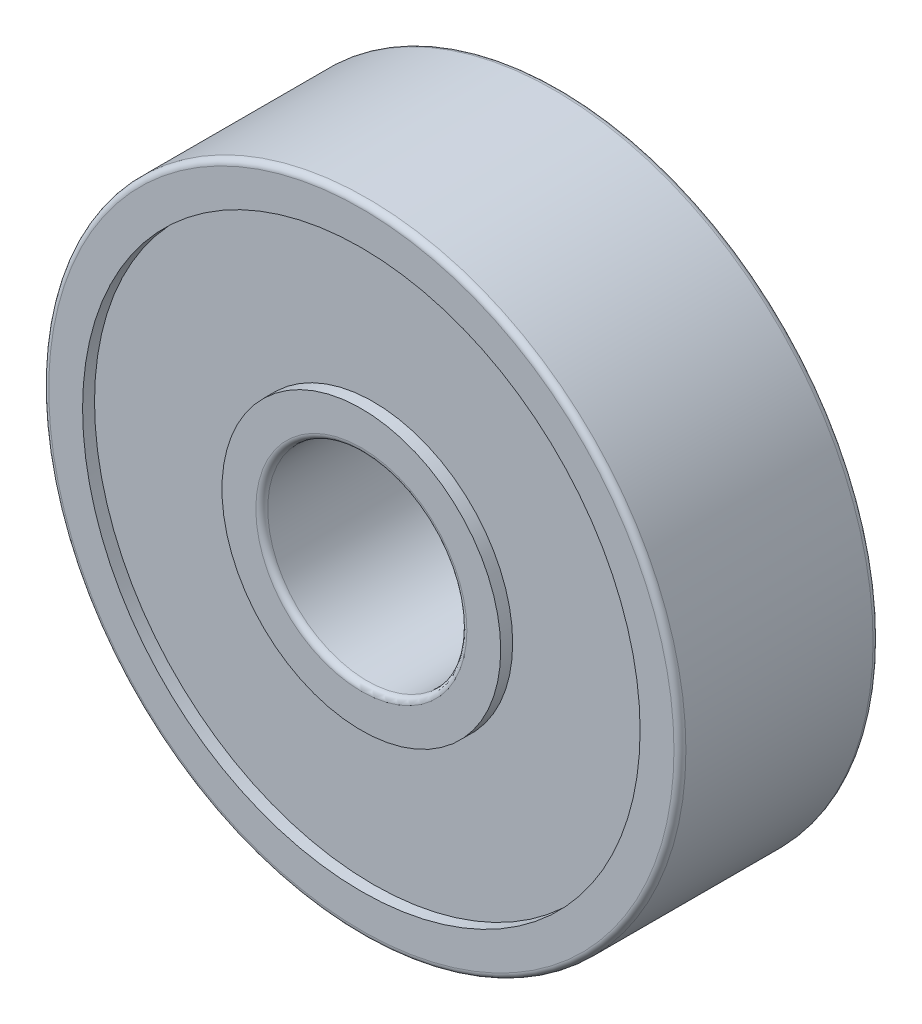
ISO-10303-21;
HEADER;
FILE_DESCRIPTION(('STEP AP214'),'2;1');
FILE_NAME('part.step','',(''),(''),'','','');
FILE_SCHEMA(('AUTOMOTIVE_DESIGN { 1 0 10303 214 1 1 1 1 }'));
ENDSEC;
DATA;
#1=APPLICATION_CONTEXT('core data for automotive mechanical design processes');
#2=APPLICATION_PROTOCOL_DEFINITION('international standard','automotive_design',2000,#1);
#3=PRODUCT_CONTEXT('',#1,'mechanical');
#4=PRODUCT('Part','Part','',(#3));
#5=PRODUCT_RELATED_PRODUCT_CATEGORY('part','',(#4));
#6=PRODUCT_DEFINITION_FORMATION('','',#4);
#7=PRODUCT_DEFINITION_CONTEXT('part definition',#1,'design');
#8=PRODUCT_DEFINITION('design','',#6,#7);
#9=PRODUCT_DEFINITION_SHAPE('','',#8);
#10=(LENGTH_UNIT() NAMED_UNIT(*) SI_UNIT(.MILLI.,.METRE.));
#11=(NAMED_UNIT(*) PLANE_ANGLE_UNIT() SI_UNIT($,.RADIAN.));
#12=(NAMED_UNIT(*) SI_UNIT($,.STERADIAN.) SOLID_ANGLE_UNIT());
#13=UNCERTAINTY_MEASURE_WITH_UNIT(LENGTH_MEASURE(1.E-05),#10,'distance_accuracy_value','');
#14=(GEOMETRIC_REPRESENTATION_CONTEXT(3) GLOBAL_UNCERTAINTY_ASSIGNED_CONTEXT((#13)) GLOBAL_UNIT_ASSIGNED_CONTEXT((#10,
#11,#12)) REPRESENTATION_CONTEXT('',''));
#15=CARTESIAN_POINT('',(0.,0.,0.));
#16=DIRECTION('',(0.,0.,1.));
#17=DIRECTION('',(1.,0.,0.));
#18=AXIS2_PLACEMENT_3D('',#15,#16,#17);
#19=CARTESIAN_POINT('',(0.,0.,0.));
#20=DIRECTION('',(0.,0.,1.));
#21=DIRECTION('',(1.,0.,0.));
#22=AXIS2_PLACEMENT_3D('',#19,#20,#21);
#23=PLANE('',#22);
#24=CARTESIAN_POINT('',(0.,0.,0.));
#25=DIRECTION('',(0.,0.,1.));
#26=DIRECTION('',(1.,0.,0.));
#27=AXIS2_PLACEMENT_3D('',#24,#25,#26);
#28=CIRCLE('',#27,2.65);
#29=CARTESIAN_POINT('',(2.65,0.,0.));
#30=VERTEX_POINT('',#29);
#31=EDGE_CURVE('E62',#30,#30,#28,.T.);
#32=ORIENTED_EDGE('',*,*,#31,.T.);
#33=EDGE_LOOP('',(#32));
#34=FACE_BOUND('',#33,.T.);
#35=CARTESIAN_POINT('',(0.,0.,0.));
#36=DIRECTION('',(0.,0.,1.));
#37=DIRECTION('',(1.,0.,0.));
#38=AXIS2_PLACEMENT_3D('',#35,#36,#37);
#39=CIRCLE('',#38,3.5);
#40=CARTESIAN_POINT('',(3.5,0.,0.));
#41=VERTEX_POINT('',#40);
#42=EDGE_CURVE('E84',#41,#41,#39,.T.);
#43=ORIENTED_EDGE('',*,*,#42,.F.);
#44=EDGE_LOOP('',(#43));
#45=FACE_BOUND('',#44,.T.);
#46=ADVANCED_FACE('F33',(#34,#45),#23,.F.);
#47=CARTESIAN_POINT('',(0.,0.,5.));
#48=DIRECTION('',(0.,0.,1.));
#49=DIRECTION('',(1.,0.,0.));
#50=AXIS2_PLACEMENT_3D('',#47,#48,#49);
#51=PLANE('',#50);
#52=CARTESIAN_POINT('',(0.,0.,5.));
#53=DIRECTION('',(0.,0.,1.));
#54=DIRECTION('',(1.,0.,0.));
#55=AXIS2_PLACEMENT_3D('',#52,#53,#54);
#56=CIRCLE('',#55,2.65);
#57=CARTESIAN_POINT('',(2.65,0.,5.));
#58=VERTEX_POINT('',#57);
#59=EDGE_CURVE('E40',#58,#58,#56,.F.);
#60=ORIENTED_EDGE('',*,*,#59,.T.);
#61=EDGE_LOOP('',(#60));
#62=FACE_BOUND('',#61,.T.);
#63=CARTESIAN_POINT('',(0.,0.,5.));
#64=DIRECTION('',(0.,0.,1.));
#65=DIRECTION('',(1.,0.,0.));
#66=AXIS2_PLACEMENT_3D('',#63,#64,#65);
#67=CIRCLE('',#66,3.5);
#68=CARTESIAN_POINT('',(3.5,0.,5.));
#69=VERTEX_POINT('',#68);
#70=EDGE_CURVE('E72',#69,#69,#67,.T.);
#71=ORIENTED_EDGE('',*,*,#70,.T.);
#72=EDGE_LOOP('',(#71));
#73=FACE_BOUND('',#72,.T.);
#74=ADVANCED_FACE('F101',(#62,#73),#51,.T.);
#75=CARTESIAN_POINT('',(0.,0.,5.));
#76=DIRECTION('',(0.,0.,1.));
#77=DIRECTION('',(1.,0.,0.));
#78=AXIS2_PLACEMENT_3D('',#75,#76,#77);
#79=CIRCLE('',#78,7.85);
#80=CARTESIAN_POINT('',(7.85,0.,5.));
#81=VERTEX_POINT('',#80);
#82=EDGE_CURVE('E10',#81,#81,#79,.T.);
#83=ORIENTED_EDGE('',*,*,#82,.T.);
#84=EDGE_LOOP('',(#83));
#85=FACE_BOUND('',#84,.T.);
#86=CARTESIAN_POINT('',(0.,0.,5.));
#87=DIRECTION('',(0.,0.,1.));
#88=DIRECTION('',(1.,0.,0.));
#89=AXIS2_PLACEMENT_3D('',#86,#87,#88);
#90=CIRCLE('',#89,7.);
#91=CARTESIAN_POINT('',(7.,0.,5.));
#92=VERTEX_POINT('',#91);
#93=EDGE_CURVE('E66',#92,#92,#90,.T.);
#94=ORIENTED_EDGE('',*,*,#93,.F.);
#95=EDGE_LOOP('',(#94));
#96=FACE_BOUND('',#95,.T.);
#97=ADVANCED_FACE('F108',(#85,#96),#51,.T.);
#98=CARTESIAN_POINT('',(0.,0.,0.));
#99=DIRECTION('',(0.,0.,1.));
#100=DIRECTION('',(1.,0.,0.));
#101=AXIS2_PLACEMENT_3D('',#98,#99,#100);
#102=CIRCLE('',#101,7.85);
#103=CARTESIAN_POINT('',(7.85,0.,0.));
#104=VERTEX_POINT('',#103);
#105=EDGE_CURVE('E44',#104,#104,#102,.F.);
#106=ORIENTED_EDGE('',*,*,#105,.T.);
#107=EDGE_LOOP('',(#106));
#108=FACE_BOUND('',#107,.T.);
#109=CARTESIAN_POINT('',(0.,0.,0.));
#110=DIRECTION('',(0.,0.,1.));
#111=DIRECTION('',(1.,0.,0.));
#112=AXIS2_PLACEMENT_3D('',#109,#110,#111);
#113=CIRCLE('',#112,7.);
#114=CARTESIAN_POINT('',(7.,0.,0.));
#115=VERTEX_POINT('',#114);
#116=EDGE_CURVE('E78',#115,#115,#113,.T.);
#117=ORIENTED_EDGE('',*,*,#116,.T.);
#118=EDGE_LOOP('',(#117));
#119=FACE_BOUND('',#118,.T.);
#120=ADVANCED_FACE('F104',(#108,#119),#23,.F.);
#121=CARTESIAN_POINT('',(0.,0.,5.));
#122=DIRECTION('',(0.,0.,-1.));
#123=DIRECTION('',(-1.,0.,0.));
#124=AXIS2_PLACEMENT_3D('',#121,#122,#123);
#125=CYLINDRICAL_SURFACE('',#124,8.);
#126=CARTESIAN_POINT('',(0.,0.,0.15));
#127=DIRECTION('',(0.,0.,1.));
#128=DIRECTION('',(1.,0.,0.));
#129=AXIS2_PLACEMENT_3D('',#126,#127,#128);
#130=CIRCLE('',#129,8.);
#131=CARTESIAN_POINT('',(8.,0.,0.15));
#132=VERTEX_POINT('',#131);
#133=EDGE_CURVE('E48',#132,#132,#130,.T.);
#134=ORIENTED_EDGE('',*,*,#133,.T.);
#135=EDGE_LOOP('',(#134));
#136=FACE_BOUND('',#135,.T.);
#137=CARTESIAN_POINT('',(0.,0.,4.85));
#138=DIRECTION('',(0.,0.,1.));
#139=DIRECTION('',(1.,0.,0.));
#140=AXIS2_PLACEMENT_3D('',#137,#138,#139);
#141=CIRCLE('',#140,8.);
#142=CARTESIAN_POINT('',(8.,0.,4.85));
#143=VERTEX_POINT('',#142);
#144=EDGE_CURVE('E53',#143,#143,#141,.F.);
#145=ORIENTED_EDGE('',*,*,#144,.T.);
#146=EDGE_LOOP('',(#145));
#147=FACE_BOUND('',#146,.T.);
#148=ADVANCED_FACE('F112',(#136,#147),#125,.T.);
#149=CARTESIAN_POINT('',(0.,0.,5.));
#150=DIRECTION('',(0.,0.,-1.));
#151=DIRECTION('',(-1.,0.,0.));
#152=AXIS2_PLACEMENT_3D('',#149,#150,#151);
#153=CYLINDRICAL_SURFACE('',#152,2.5);
#154=CARTESIAN_POINT('',(0.,0.,0.15));
#155=DIRECTION('',(0.,0.,1.));
#156=DIRECTION('',(1.,0.,0.));
#157=AXIS2_PLACEMENT_3D('',#154,#155,#156);
#158=CIRCLE('',#157,2.5);
#159=CARTESIAN_POINT('',(2.5,0.,0.15));
#160=VERTEX_POINT('',#159);
#161=EDGE_CURVE('E56',#160,#160,#158,.F.);
#162=ORIENTED_EDGE('',*,*,#161,.T.);
#163=EDGE_LOOP('',(#162));
#164=FACE_BOUND('',#163,.T.);
#165=CARTESIAN_POINT('',(0.,0.,4.85));
#166=DIRECTION('',(0.,0.,1.));
#167=DIRECTION('',(1.,0.,0.));
#168=AXIS2_PLACEMENT_3D('',#165,#166,#167);
#169=CIRCLE('',#168,2.5);
#170=CARTESIAN_POINT('',(2.5,0.,4.85));
#171=VERTEX_POINT('',#170);
#172=EDGE_CURVE('E59',#171,#171,#169,.T.);
#173=ORIENTED_EDGE('',*,*,#172,.T.);
#174=EDGE_LOOP('',(#173));
#175=FACE_BOUND('',#174,.T.);
#176=ADVANCED_FACE('F118',(#164,#175),#153,.F.);
#177=CARTESIAN_POINT('',(0.,0.,4.7));
#178=DIRECTION('',(0.,0.,1.));
#179=DIRECTION('',(1.,0.,0.));
#180=AXIS2_PLACEMENT_3D('',#177,#178,#179);
#181=CYLINDRICAL_SURFACE('',#180,7.);
#182=CARTESIAN_POINT('',(0.,0.,4.7));
#183=DIRECTION('',(0.,0.,1.));
#184=DIRECTION('',(1.,0.,0.));
#185=AXIS2_PLACEMENT_3D('',#182,#183,#184);
#186=CIRCLE('',#185,7.);
#187=CARTESIAN_POINT('',(7.,0.,4.7));
#188=VERTEX_POINT('',#187);
#189=EDGE_CURVE('E65',#188,#188,#186,.T.);
#190=ORIENTED_EDGE('',*,*,#189,.F.);
#191=EDGE_LOOP('',(#190));
#192=FACE_BOUND('',#191,.T.);
#193=ORIENTED_EDGE('',*,*,#93,.T.);
#194=EDGE_LOOP('',(#193));
#195=FACE_BOUND('',#194,.T.);
#196=ADVANCED_FACE('F140',(#192,#195),#181,.F.);
#197=CARTESIAN_POINT('',(0.,0.,4.7));
#198=DIRECTION('',(0.,0.,1.));
#199=DIRECTION('',(1.,0.,0.));
#200=AXIS2_PLACEMENT_3D('',#197,#198,#199);
#201=PLANE('',#200);
#202=CARTESIAN_POINT('',(0.,0.,4.7));
#203=DIRECTION('',(0.,0.,1.));
#204=DIRECTION('',(1.,0.,0.));
#205=AXIS2_PLACEMENT_3D('',#202,#203,#204);
#206=CIRCLE('',#205,3.5);
#207=CARTESIAN_POINT('',(3.5,0.,4.7));
#208=VERTEX_POINT('',#207);
#209=EDGE_CURVE('E69',#208,#208,#206,.T.);
#210=ORIENTED_EDGE('',*,*,#209,.F.);
#211=EDGE_LOOP('',(#210));
#212=FACE_BOUND('',#211,.T.);
#213=ORIENTED_EDGE('',*,*,#189,.T.);
#214=EDGE_LOOP('',(#213));
#215=FACE_BOUND('',#214,.T.);
#216=ADVANCED_FACE('F136',(#212,#215),#201,.T.);
#217=CARTESIAN_POINT('',(0.,0.,4.7));
#218=DIRECTION('',(0.,0.,1.));
#219=DIRECTION('',(1.,0.,0.));
#220=AXIS2_PLACEMENT_3D('',#217,#218,#219);
#221=CYLINDRICAL_SURFACE('',#220,3.5);
#222=ORIENTED_EDGE('',*,*,#209,.T.);
#223=EDGE_LOOP('',(#222));
#224=FACE_BOUND('',#223,.T.);
#225=ORIENTED_EDGE('',*,*,#70,.F.);
#226=EDGE_LOOP('',(#225));
#227=FACE_BOUND('',#226,.T.);
#228=ADVANCED_FACE('F130',(#224,#227),#221,.T.);
#229=CARTESIAN_POINT('',(0.,0.,0.5));
#230=DIRECTION('',(0.,0.,1.));
#231=DIRECTION('',(1.,0.,0.));
#232=AXIS2_PLACEMENT_3D('',#229,#230,#231);
#233=PLANE('',#232);
#234=CARTESIAN_POINT('',(0.,0.,0.5));
#235=DIRECTION('',(0.,0.,1.));
#236=DIRECTION('',(1.,0.,0.));
#237=AXIS2_PLACEMENT_3D('',#234,#235,#236);
#238=CIRCLE('',#237,7.);
#239=CARTESIAN_POINT('',(7.,0.,0.5));
#240=VERTEX_POINT('',#239);
#241=EDGE_CURVE('E75',#240,#240,#238,.T.);
#242=ORIENTED_EDGE('',*,*,#241,.F.);
#243=EDGE_LOOP('',(#242));
#244=FACE_BOUND('',#243,.T.);
#245=CARTESIAN_POINT('',(0.,0.,0.5));
#246=DIRECTION('',(0.,0.,1.));
#247=DIRECTION('',(1.,0.,0.));
#248=AXIS2_PLACEMENT_3D('',#245,#246,#247);
#249=CIRCLE('',#248,3.5);
#250=CARTESIAN_POINT('',(3.5,0.,0.5));
#251=VERTEX_POINT('',#250);
#252=EDGE_CURVE('E81',#251,#251,#249,.T.);
#253=ORIENTED_EDGE('',*,*,#252,.T.);
#254=EDGE_LOOP('',(#253));
#255=FACE_BOUND('',#254,.T.);
#256=ADVANCED_FACE('F90',(#244,#255),#233,.F.);
#257=CARTESIAN_POINT('',(0.,0.,0.5));
#258=DIRECTION('',(0.,0.,-1.));
#259=DIRECTION('',(-1.,0.,0.));
#260=AXIS2_PLACEMENT_3D('',#257,#258,#259);
#261=CYLINDRICAL_SURFACE('',#260,7.);
#262=ORIENTED_EDGE('',*,*,#241,.T.);
#263=EDGE_LOOP('',(#262));
#264=FACE_BOUND('',#263,.T.);
#265=ORIENTED_EDGE('',*,*,#116,.F.);
#266=EDGE_LOOP('',(#265));
#267=FACE_BOUND('',#266,.T.);
#268=ADVANCED_FACE('F96',(#264,#267),#261,.F.);
#269=CARTESIAN_POINT('',(0.,0.,0.5));
#270=DIRECTION('',(0.,0.,-1.));
#271=DIRECTION('',(-1.,0.,0.));
#272=AXIS2_PLACEMENT_3D('',#269,#270,#271);
#273=CYLINDRICAL_SURFACE('',#272,3.5);
#274=ORIENTED_EDGE('',*,*,#252,.F.);
#275=EDGE_LOOP('',(#274));
#276=FACE_BOUND('',#275,.T.);
#277=ORIENTED_EDGE('',*,*,#42,.T.);
#278=EDGE_LOOP('',(#277));
#279=FACE_BOUND('',#278,.T.);
#280=ADVANCED_FACE('F92',(#276,#279),#273,.T.);
#281=CARTESIAN_POINT('',(0.,0.,0.15));
#282=DIRECTION('',(0.,0.,1.));
#283=DIRECTION('',(1.,0.,0.));
#284=AXIS2_PLACEMENT_3D('',#281,#282,#283);
#285=TOROIDAL_SURFACE('',#284,2.65,0.15);
#286=ORIENTED_EDGE('',*,*,#161,.F.);
#287=EDGE_LOOP('',(#286));
#288=FACE_BOUND('',#287,.T.);
#289=ORIENTED_EDGE('',*,*,#31,.F.);
#290=EDGE_LOOP('',(#289));
#291=FACE_BOUND('',#290,.T.);
#292=ADVANCED_FACE('F95',(#288,#291),#285,.T.);
#293=CARTESIAN_POINT('',(0.,0.,0.15));
#294=DIRECTION('',(0.,0.,1.));
#295=DIRECTION('',(1.,0.,0.));
#296=AXIS2_PLACEMENT_3D('',#293,#294,#295);
#297=TOROIDAL_SURFACE('',#296,7.85,0.15);
#298=ORIENTED_EDGE('',*,*,#105,.F.);
#299=EDGE_LOOP('',(#298));
#300=FACE_BOUND('',#299,.T.);
#301=ORIENTED_EDGE('',*,*,#133,.F.);
#302=EDGE_LOOP('',(#301));
#303=FACE_BOUND('',#302,.T.);
#304=ADVANCED_FACE('F155',(#300,#303),#297,.T.);
#305=CARTESIAN_POINT('',(0.,0.,4.85));
#306=DIRECTION('',(0.,0.,1.));
#307=DIRECTION('',(1.,0.,0.));
#308=AXIS2_PLACEMENT_3D('',#305,#306,#307);
#309=TOROIDAL_SURFACE('',#308,2.65,0.15);
#310=ORIENTED_EDGE('',*,*,#59,.F.);
#311=EDGE_LOOP('',(#310));
#312=FACE_BOUND('',#311,.T.);
#313=ORIENTED_EDGE('',*,*,#172,.F.);
#314=EDGE_LOOP('',(#313));
#315=FACE_BOUND('',#314,.T.);
#316=ADVANCED_FACE('F153',(#312,#315),#309,.T.);
#317=CARTESIAN_POINT('',(0.,0.,4.85));
#318=DIRECTION('',(0.,0.,1.));
#319=DIRECTION('',(1.,0.,0.));
#320=AXIS2_PLACEMENT_3D('',#317,#318,#319);
#321=TOROIDAL_SURFACE('',#320,7.85,0.15);
#322=ORIENTED_EDGE('',*,*,#144,.F.);
#323=EDGE_LOOP('',(#322));
#324=FACE_BOUND('',#323,.T.);
#325=ORIENTED_EDGE('',*,*,#82,.F.);
#326=EDGE_LOOP('',(#325));
#327=FACE_BOUND('',#326,.T.);
#328=ADVANCED_FACE('F35',(#324,#327),#321,.T.);
#329=CLOSED_SHELL('',(#46,#74,#97,#120,#148,#176,#196,#216,#228,#256,#268,#280,#292,#304,#316,#328));
#330=MANIFOLD_SOLID_BREP('B2',#329);
#331=ADVANCED_BREP_SHAPE_REPRESENTATION('',(#18,#330),#14);
#332=SHAPE_DEFINITION_REPRESENTATION(#9,#331);
ENDSEC;
END-ISO-10303-21;
